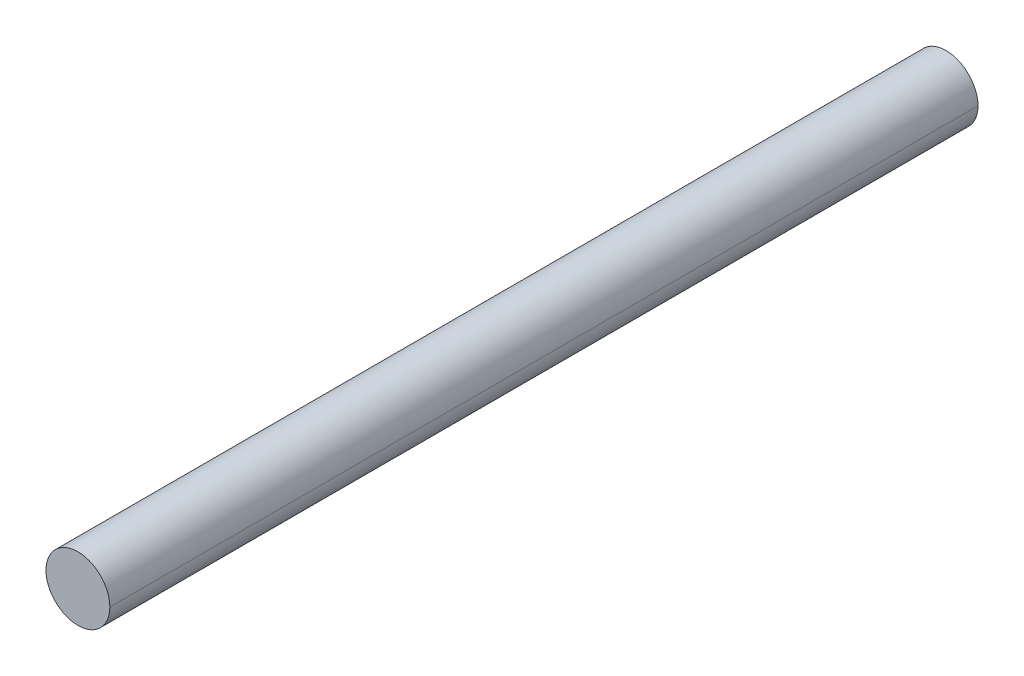
ISO-10303-21;
HEADER;
FILE_DESCRIPTION(('STEP AP214'),'2;1');
FILE_NAME('part.step','',(''),(''),'','','');
FILE_SCHEMA(('AUTOMOTIVE_DESIGN { 1 0 10303 214 1 1 1 1 }'));
ENDSEC;
DATA;
#1=APPLICATION_CONTEXT('core data for automotive mechanical design processes');
#2=APPLICATION_PROTOCOL_DEFINITION('international standard','automotive_design',2000,#1);
#3=PRODUCT_CONTEXT('',#1,'mechanical');
#4=PRODUCT('Part','Part','',(#3));
#5=PRODUCT_RELATED_PRODUCT_CATEGORY('part','',(#4));
#6=PRODUCT_DEFINITION_FORMATION('','',#4);
#7=PRODUCT_DEFINITION_CONTEXT('part definition',#1,'design');
#8=PRODUCT_DEFINITION('design','',#6,#7);
#9=PRODUCT_DEFINITION_SHAPE('','',#8);
#10=(LENGTH_UNIT() NAMED_UNIT(*) SI_UNIT(.MILLI.,.METRE.));
#11=(NAMED_UNIT(*) PLANE_ANGLE_UNIT() SI_UNIT($,.RADIAN.));
#12=(NAMED_UNIT(*) SI_UNIT($,.STERADIAN.) SOLID_ANGLE_UNIT());
#13=UNCERTAINTY_MEASURE_WITH_UNIT(LENGTH_MEASURE(1.E-05),#10,'distance_accuracy_value','');
#14=(GEOMETRIC_REPRESENTATION_CONTEXT(3) GLOBAL_UNCERTAINTY_ASSIGNED_CONTEXT((#13)) GLOBAL_UNIT_ASSIGNED_CONTEXT((#10,
#11,#12)) REPRESENTATION_CONTEXT('',''));
#15=CARTESIAN_POINT('',(0.,0.,0.));
#16=DIRECTION('',(0.,0.,1.));
#17=DIRECTION('',(1.,0.,0.));
#18=AXIS2_PLACEMENT_3D('',#15,#16,#17);
#19=CARTESIAN_POINT('',(0.,0.,21.59));
#20=DIRECTION('',(0.,0.,-1.));
#21=DIRECTION('',(-1.,0.,0.));
#22=AXIS2_PLACEMENT_3D('',#19,#20,#21);
#23=CYLINDRICAL_SURFACE('',#22,1.5875);
#24=CARTESIAN_POINT('',(0.,0.,21.59));
#25=DIRECTION('',(0.,0.,1.));
#26=DIRECTION('',(1.,0.,0.));
#27=AXIS2_PLACEMENT_3D('',#24,#25,#26);
#28=CIRCLE('',#27,1.5875);
#29=CARTESIAN_POINT('',(1.5875,0.,21.59));
#30=VERTEX_POINT('',#29);
#31=CARTESIAN_POINT('',(-1.5875,0.,21.59));
#32=VERTEX_POINT('',#31);
#33=EDGE_CURVE('E38',#30,#32,#28,.T.);
#34=ORIENTED_EDGE('',*,*,#33,.F.);
#35=DIRECTION('',(0.,0.,-1.));
#36=VECTOR('',#35,1.);
#37=CARTESIAN_POINT('',(1.5875,0.,21.59));
#38=LINE('',#37,#36);
#39=CARTESIAN_POINT('',(1.5875,0.,-21.59));
#40=VERTEX_POINT('',#39);
#41=EDGE_CURVE('E11',#30,#40,#38,.T.);
#42=ORIENTED_EDGE('',*,*,#41,.T.);
#43=CARTESIAN_POINT('',(0.,0.,-21.59));
#44=DIRECTION('',(0.,0.,1.));
#45=DIRECTION('',(1.,0.,0.));
#46=AXIS2_PLACEMENT_3D('',#43,#44,#45);
#47=CIRCLE('',#46,1.5875);
#48=CARTESIAN_POINT('',(-1.5875,0.,-21.59));
#49=VERTEX_POINT('',#48);
#50=EDGE_CURVE('E27',#40,#49,#47,.T.);
#51=ORIENTED_EDGE('',*,*,#50,.T.);
#52=DIRECTION('',(0.,0.,-1.));
#53=VECTOR('',#52,1.);
#54=CARTESIAN_POINT('',(-1.5875,0.,21.59));
#55=LINE('',#54,#53);
#56=EDGE_CURVE('E53',#32,#49,#55,.T.);
#57=ORIENTED_EDGE('',*,*,#56,.F.);
#58=EDGE_LOOP('',(#34,#42,#51,#57));
#59=FACE_BOUND('',#58,.T.);
#60=ADVANCED_FACE('F17',(#59),#23,.T.);
#61=CARTESIAN_POINT('',(0.,0.,21.59));
#62=DIRECTION('',(0.,0.,-1.));
#63=DIRECTION('',(-1.,0.,0.));
#64=AXIS2_PLACEMENT_3D('',#61,#62,#63);
#65=CYLINDRICAL_SURFACE('',#64,1.5875);
#66=ORIENTED_EDGE('',*,*,#41,.F.);
#67=CARTESIAN_POINT('',(0.,0.,21.59));
#68=DIRECTION('',(0.,0.,1.));
#69=DIRECTION('',(1.,0.,0.));
#70=AXIS2_PLACEMENT_3D('',#67,#68,#69);
#71=CIRCLE('',#70,1.5875);
#72=EDGE_CURVE('E58',#32,#30,#71,.T.);
#73=ORIENTED_EDGE('',*,*,#72,.F.);
#74=ORIENTED_EDGE('',*,*,#56,.T.);
#75=CARTESIAN_POINT('',(0.,0.,-21.59));
#76=DIRECTION('',(0.,0.,1.));
#77=DIRECTION('',(1.,0.,0.));
#78=AXIS2_PLACEMENT_3D('',#75,#76,#77);
#79=CIRCLE('',#78,1.5875);
#80=EDGE_CURVE('E56',#49,#40,#79,.T.);
#81=ORIENTED_EDGE('',*,*,#80,.T.);
#82=EDGE_LOOP('',(#66,#73,#74,#81));
#83=FACE_BOUND('',#82,.T.);
#84=ADVANCED_FACE('F19',(#83),#65,.T.);
#85=CARTESIAN_POINT('',(0.,0.,21.59));
#86=DIRECTION('',(0.,0.,1.));
#87=DIRECTION('',(1.,0.,0.));
#88=AXIS2_PLACEMENT_3D('',#85,#86,#87);
#89=PLANE('',#88);
#90=ORIENTED_EDGE('',*,*,#72,.T.);
#91=ORIENTED_EDGE('',*,*,#33,.T.);
#92=EDGE_LOOP('',(#90,#91));
#93=FACE_BOUND('',#92,.T.);
#94=ADVANCED_FACE('F75',(#93),#89,.T.);
#95=CARTESIAN_POINT('',(0.,0.,-21.59));
#96=DIRECTION('',(0.,0.,1.));
#97=DIRECTION('',(1.,0.,0.));
#98=AXIS2_PLACEMENT_3D('',#95,#96,#97);
#99=PLANE('',#98);
#100=ORIENTED_EDGE('',*,*,#80,.F.);
#101=ORIENTED_EDGE('',*,*,#50,.F.);
#102=EDGE_LOOP('',(#100,#101));
#103=FACE_BOUND('',#102,.T.);
#104=ADVANCED_FACE('F64',(#103),#99,.F.);
#105=CLOSED_SHELL('',(#60,#84,#94,#104));
#106=MANIFOLD_SOLID_BREP('B1',#105);
#107=ADVANCED_BREP_SHAPE_REPRESENTATION('',(#18,#106),#14);
#108=SHAPE_DEFINITION_REPRESENTATION(#9,#107);
ENDSEC;
END-ISO-10303-21;
